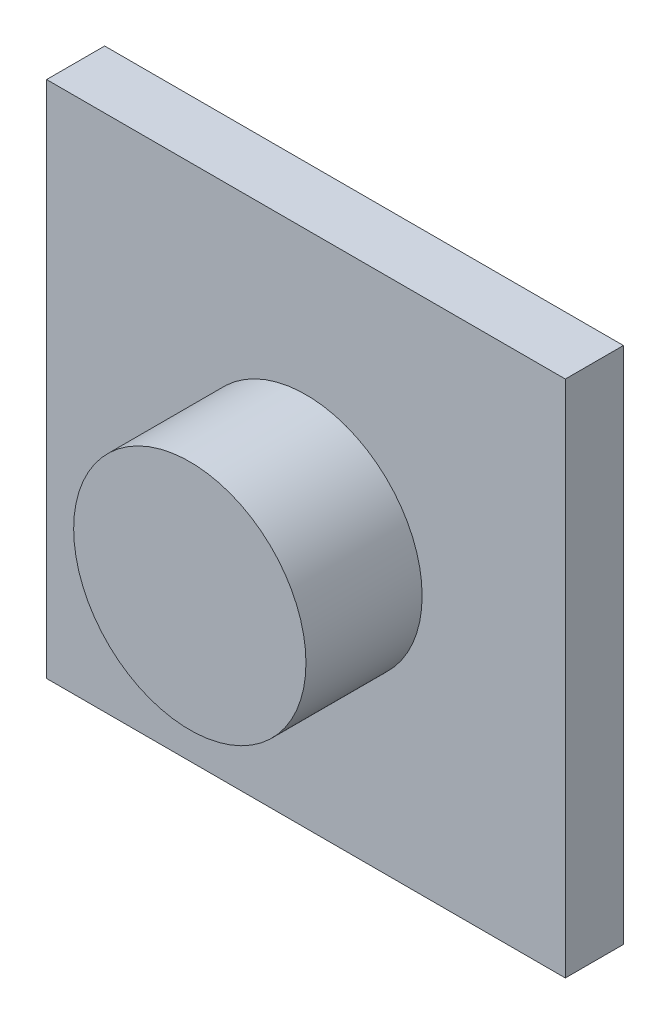
ISO-10303-21;
HEADER;
FILE_DESCRIPTION(('STEP AP214'),'2;1');
FILE_NAME('part.step','',(''),(''),'','','');
FILE_SCHEMA(('AUTOMOTIVE_DESIGN { 1 0 10303 214 1 1 1 1 }'));
ENDSEC;
DATA;
#1=APPLICATION_CONTEXT('core data for automotive mechanical design processes');
#2=APPLICATION_PROTOCOL_DEFINITION('international standard','automotive_design',2000,#1);
#3=PRODUCT_CONTEXT('',#1,'mechanical');
#4=PRODUCT('Part','Part','',(#3));
#5=PRODUCT_RELATED_PRODUCT_CATEGORY('part','',(#4));
#6=PRODUCT_DEFINITION_FORMATION('','',#4);
#7=PRODUCT_DEFINITION_CONTEXT('part definition',#1,'design');
#8=PRODUCT_DEFINITION('design','',#6,#7);
#9=PRODUCT_DEFINITION_SHAPE('','',#8);
#10=(LENGTH_UNIT() NAMED_UNIT(*) SI_UNIT(.MILLI.,.METRE.));
#11=(NAMED_UNIT(*) PLANE_ANGLE_UNIT() SI_UNIT($,.RADIAN.));
#12=(NAMED_UNIT(*) SI_UNIT($,.STERADIAN.) SOLID_ANGLE_UNIT());
#13=UNCERTAINTY_MEASURE_WITH_UNIT(LENGTH_MEASURE(1.E-05),#10,'distance_accuracy_value','');
#14=(GEOMETRIC_REPRESENTATION_CONTEXT(3) GLOBAL_UNCERTAINTY_ASSIGNED_CONTEXT((#13)) GLOBAL_UNIT_ASSIGNED_CONTEXT((#10,
#11,#12)) REPRESENTATION_CONTEXT('',''));
#15=CARTESIAN_POINT('',(0.,0.,0.));
#16=DIRECTION('',(0.,0.,1.));
#17=DIRECTION('',(1.,0.,0.));
#18=AXIS2_PLACEMENT_3D('',#15,#16,#17);
#19=CARTESIAN_POINT('',(0.,0.,100.));
#20=DIRECTION('',(0.,0.,-1.));
#21=DIRECTION('',(-1.,0.,0.));
#22=AXIS2_PLACEMENT_3D('',#19,#20,#21);
#23=CYLINDRICAL_SURFACE('',#22,100.);
#24=CARTESIAN_POINT('',(0.,0.,100.));
#25=DIRECTION('',(0.,0.,1.));
#26=DIRECTION('',(1.,0.,0.));
#27=AXIS2_PLACEMENT_3D('',#24,#25,#26);
#28=CIRCLE('',#27,100.);
#29=CARTESIAN_POINT('',(100.,0.,100.));
#30=VERTEX_POINT('',#29);
#31=EDGE_CURVE('E11',#30,#30,#28,.T.);
#32=ORIENTED_EDGE('',*,*,#31,.F.);
#33=EDGE_LOOP('',(#32));
#34=FACE_BOUND('',#33,.T.);
#35=CARTESIAN_POINT('',(0.,0.,0.));
#36=DIRECTION('',(0.,0.,1.));
#37=DIRECTION('',(1.,0.,0.));
#38=AXIS2_PLACEMENT_3D('',#35,#36,#37);
#39=CIRCLE('',#38,100.);
#40=CARTESIAN_POINT('',(100.,0.,0.));
#41=VERTEX_POINT('',#40);
#42=EDGE_CURVE('E40',#41,#41,#39,.T.);
#43=ORIENTED_EDGE('',*,*,#42,.T.);
#44=EDGE_LOOP('',(#43));
#45=FACE_BOUND('',#44,.T.);
#46=ADVANCED_FACE('F37',(#34,#45),#23,.T.);
#47=CARTESIAN_POINT('',(0.,0.,100.));
#48=DIRECTION('',(0.,0.,1.));
#49=DIRECTION('',(1.,0.,0.));
#50=AXIS2_PLACEMENT_3D('',#47,#48,#49);
#51=PLANE('',#50);
#52=ORIENTED_EDGE('',*,*,#31,.T.);
#53=EDGE_LOOP('',(#52));
#54=FACE_BOUND('',#53,.T.);
#55=ADVANCED_FACE('F133',(#54),#51,.T.);
#56=CARTESIAN_POINT('',(-223.3,223.3,-50.));
#57=DIRECTION('',(1.,0.,0.));
#58=DIRECTION('',(0.,1.,0.));
#59=AXIS2_PLACEMENT_3D('',#56,#57,#58);
#60=PLANE('',#59);
#61=DIRECTION('',(0.,1.,0.));
#62=VECTOR('',#61,1.);
#63=CARTESIAN_POINT('',(-223.3,223.3,0.));
#64=LINE('',#63,#62);
#65=CARTESIAN_POINT('',(-223.3,-223.3,0.));
#66=VERTEX_POINT('',#65);
#67=CARTESIAN_POINT('',(-223.3,223.3,0.));
#68=VERTEX_POINT('',#67);
#69=EDGE_CURVE('E104',#66,#68,#64,.T.);
#70=ORIENTED_EDGE('',*,*,#69,.T.);
#71=DIRECTION('',(0.,0.,1.));
#72=VECTOR('',#71,1.);
#73=CARTESIAN_POINT('',(-223.3,223.3,-50.));
#74=LINE('',#73,#72);
#75=CARTESIAN_POINT('',(-223.3,223.3,-50.));
#76=VERTEX_POINT('',#75);
#77=EDGE_CURVE('E95',#76,#68,#74,.T.);
#78=ORIENTED_EDGE('',*,*,#77,.F.);
#79=DIRECTION('',(0.,1.,0.));
#80=VECTOR('',#79,1.);
#81=CARTESIAN_POINT('',(-223.3,223.3,-50.));
#82=LINE('',#81,#80);
#83=CARTESIAN_POINT('',(-223.3,-223.3,-50.));
#84=VERTEX_POINT('',#83);
#85=EDGE_CURVE('E89',#84,#76,#82,.T.);
#86=ORIENTED_EDGE('',*,*,#85,.F.);
#87=DIRECTION('',(0.,0.,1.));
#88=VECTOR('',#87,1.);
#89=CARTESIAN_POINT('',(-223.3,-223.3,-50.));
#90=LINE('',#89,#88);
#91=EDGE_CURVE('E100',#84,#66,#90,.T.);
#92=ORIENTED_EDGE('',*,*,#91,.T.);
#93=EDGE_LOOP('',(#70,#78,#86,#92));
#94=FACE_BOUND('',#93,.T.);
#95=ADVANCED_FACE('F122',(#94),#60,.F.);
#96=CARTESIAN_POINT('',(223.3,223.3,-50.));
#97=DIRECTION('',(0.,-1.,0.));
#98=DIRECTION('',(0.,0.,-1.));
#99=AXIS2_PLACEMENT_3D('',#96,#97,#98);
#100=PLANE('',#99);
#101=DIRECTION('',(1.,0.,0.));
#102=VECTOR('',#101,1.);
#103=CARTESIAN_POINT('',(223.3,223.3,0.));
#104=LINE('',#103,#102);
#105=CARTESIAN_POINT('',(223.3,223.3,0.));
#106=VERTEX_POINT('',#105);
#107=EDGE_CURVE('E94',#68,#106,#104,.T.);
#108=ORIENTED_EDGE('',*,*,#107,.T.);
#109=DIRECTION('',(0.,0.,1.));
#110=VECTOR('',#109,1.);
#111=CARTESIAN_POINT('',(223.3,223.3,-50.));
#112=LINE('',#111,#110);
#113=CARTESIAN_POINT('',(223.3,223.3,-50.));
#114=VERTEX_POINT('',#113);
#115=EDGE_CURVE('E92',#114,#106,#112,.T.);
#116=ORIENTED_EDGE('',*,*,#115,.F.);
#117=DIRECTION('',(1.,0.,0.));
#118=VECTOR('',#117,1.);
#119=CARTESIAN_POINT('',(223.3,223.3,-50.));
#120=LINE('',#119,#118);
#121=EDGE_CURVE('E84',#76,#114,#120,.T.);
#122=ORIENTED_EDGE('',*,*,#121,.F.);
#123=ORIENTED_EDGE('',*,*,#77,.T.);
#124=EDGE_LOOP('',(#108,#116,#122,#123));
#125=FACE_BOUND('',#124,.T.);
#126=ADVANCED_FACE('F93',(#125),#100,.F.);
#127=CARTESIAN_POINT('',(223.3,223.3,-50.));
#128=DIRECTION('',(-1.,0.,0.));
#129=DIRECTION('',(0.,-1.,0.));
#130=AXIS2_PLACEMENT_3D('',#127,#128,#129);
#131=PLANE('',#130);
#132=DIRECTION('',(0.,-1.,0.));
#133=VECTOR('',#132,1.);
#134=CARTESIAN_POINT('',(223.3,223.3,0.));
#135=LINE('',#134,#133);
#136=CARTESIAN_POINT('',(223.3,-223.3,0.));
#137=VERTEX_POINT('',#136);
#138=EDGE_CURVE('E70',#106,#137,#135,.T.);
#139=ORIENTED_EDGE('',*,*,#138,.T.);
#140=DIRECTION('',(0.,0.,1.));
#141=VECTOR('',#140,1.);
#142=CARTESIAN_POINT('',(223.3,-223.3,-50.));
#143=LINE('',#142,#141);
#144=CARTESIAN_POINT('',(223.3,-223.3,-50.));
#145=VERTEX_POINT('',#144);
#146=EDGE_CURVE('E96',#145,#137,#143,.T.);
#147=ORIENTED_EDGE('',*,*,#146,.F.);
#148=DIRECTION('',(0.,-1.,0.));
#149=VECTOR('',#148,1.);
#150=CARTESIAN_POINT('',(223.3,223.3,-50.));
#151=LINE('',#150,#149);
#152=EDGE_CURVE('E87',#114,#145,#151,.T.);
#153=ORIENTED_EDGE('',*,*,#152,.F.);
#154=ORIENTED_EDGE('',*,*,#115,.T.);
#155=EDGE_LOOP('',(#139,#147,#153,#154));
#156=FACE_BOUND('',#155,.T.);
#157=ADVANCED_FACE('F98',(#156),#131,.F.);
#158=CARTESIAN_POINT('',(223.3,-223.3,-50.));
#159=DIRECTION('',(0.,1.,0.));
#160=DIRECTION('',(0.,0.,1.));
#161=AXIS2_PLACEMENT_3D('',#158,#159,#160);
#162=PLANE('',#161);
#163=DIRECTION('',(-1.,0.,0.));
#164=VECTOR('',#163,1.);
#165=CARTESIAN_POINT('',(223.3,-223.3,0.));
#166=LINE('',#165,#164);
#167=EDGE_CURVE('E76',#137,#66,#166,.T.);
#168=ORIENTED_EDGE('',*,*,#167,.T.);
#169=ORIENTED_EDGE('',*,*,#91,.F.);
#170=DIRECTION('',(-1.,0.,0.));
#171=VECTOR('',#170,1.);
#172=CARTESIAN_POINT('',(223.3,-223.3,-50.));
#173=LINE('',#172,#171);
#174=EDGE_CURVE('E53',#145,#84,#173,.T.);
#175=ORIENTED_EDGE('',*,*,#174,.F.);
#176=ORIENTED_EDGE('',*,*,#146,.T.);
#177=EDGE_LOOP('',(#168,#169,#175,#176));
#178=FACE_BOUND('',#177,.T.);
#179=ADVANCED_FACE('F123',(#178),#162,.F.);
#180=CARTESIAN_POINT('',(0.,0.,-50.));
#181=DIRECTION('',(0.,0.,-1.));
#182=DIRECTION('',(-1.,0.,0.));
#183=AXIS2_PLACEMENT_3D('',#180,#181,#182);
#184=PLANE('',#183);
#185=ORIENTED_EDGE('',*,*,#85,.T.);
#186=ORIENTED_EDGE('',*,*,#121,.T.);
#187=ORIENTED_EDGE('',*,*,#152,.T.);
#188=ORIENTED_EDGE('',*,*,#174,.T.);
#189=EDGE_LOOP('',(#185,#186,#187,#188));
#190=FACE_BOUND('',#189,.T.);
#191=ADVANCED_FACE('F85',(#190),#184,.T.);
#192=CARTESIAN_POINT('',(0.,0.,0.));
#193=DIRECTION('',(0.,0.,-1.));
#194=DIRECTION('',(-1.,0.,0.));
#195=AXIS2_PLACEMENT_3D('',#192,#193,#194);
#196=PLANE('',#195);
#197=ORIENTED_EDGE('',*,*,#42,.F.);
#198=EDGE_LOOP('',(#197));
#199=FACE_BOUND('',#198,.T.);
#200=ORIENTED_EDGE('',*,*,#69,.F.);
#201=ORIENTED_EDGE('',*,*,#167,.F.);
#202=ORIENTED_EDGE('',*,*,#138,.F.);
#203=ORIENTED_EDGE('',*,*,#107,.F.);
#204=EDGE_LOOP('',(#200,#201,#202,#203));
#205=FACE_BOUND('',#204,.T.);
#206=ADVANCED_FACE('F116',(#199,#205),#196,.F.);
#207=CLOSED_SHELL('',(#46,#55,#95,#126,#157,#179,#191,#206));
#208=MANIFOLD_SOLID_BREP('B2',#207);
#209=ADVANCED_BREP_SHAPE_REPRESENTATION('',(#18,#208),#14);
#210=SHAPE_DEFINITION_REPRESENTATION(#9,#209);
ENDSEC;
END-ISO-10303-21;
